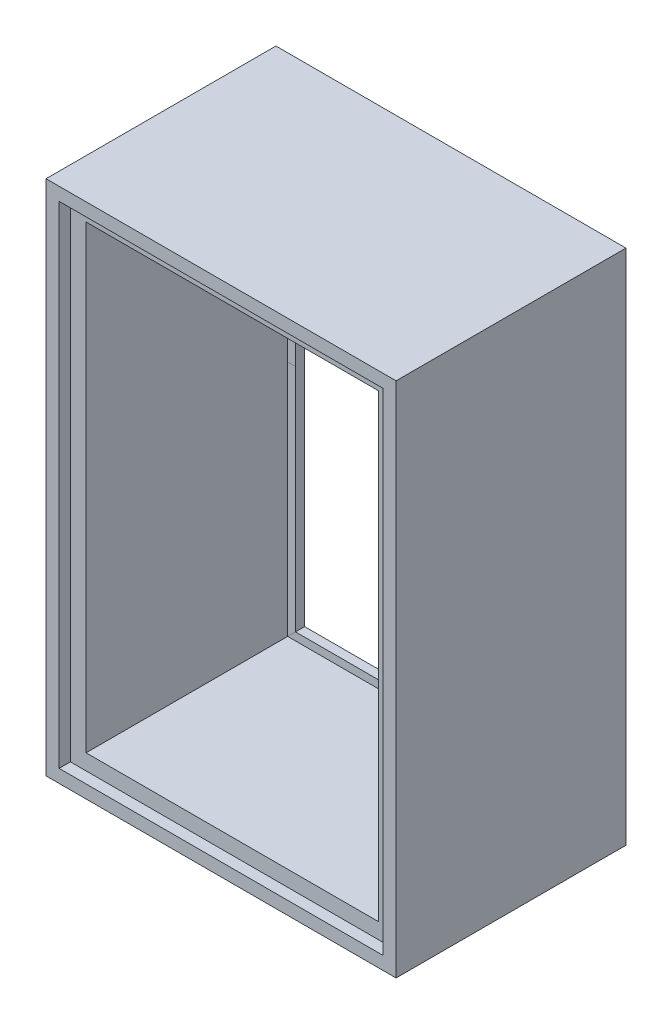
ISO-10303-21;
HEADER;
FILE_DESCRIPTION(('STEP AP214'),'2;1');
FILE_NAME('part.step','',(''),(''),'','','');
FILE_SCHEMA(('AUTOMOTIVE_DESIGN { 1 0 10303 214 1 1 1 1 }'));
ENDSEC;
DATA;
#1=APPLICATION_CONTEXT('core data for automotive mechanical design processes');
#2=APPLICATION_PROTOCOL_DEFINITION('international standard','automotive_design',2000,#1);
#3=PRODUCT_CONTEXT('',#1,'mechanical');
#4=PRODUCT('Part','Part','',(#3));
#5=PRODUCT_RELATED_PRODUCT_CATEGORY('part','',(#4));
#6=PRODUCT_DEFINITION_FORMATION('','',#4);
#7=PRODUCT_DEFINITION_CONTEXT('part definition',#1,'design');
#8=PRODUCT_DEFINITION('design','',#6,#7);
#9=PRODUCT_DEFINITION_SHAPE('','',#8);
#10=(LENGTH_UNIT() NAMED_UNIT(*) SI_UNIT(.MILLI.,.METRE.));
#11=(NAMED_UNIT(*) PLANE_ANGLE_UNIT() SI_UNIT($,.RADIAN.));
#12=(NAMED_UNIT(*) SI_UNIT($,.STERADIAN.) SOLID_ANGLE_UNIT());
#13=UNCERTAINTY_MEASURE_WITH_UNIT(LENGTH_MEASURE(1.E-05),#10,'distance_accuracy_value','');
#14=(GEOMETRIC_REPRESENTATION_CONTEXT(3) GLOBAL_UNCERTAINTY_ASSIGNED_CONTEXT((#13)) GLOBAL_UNIT_ASSIGNED_CONTEXT((#10,
#11,#12)) REPRESENTATION_CONTEXT('',''));
#15=CARTESIAN_POINT('',(0.,0.,0.));
#16=DIRECTION('',(0.,0.,1.));
#17=DIRECTION('',(1.,0.,0.));
#18=AXIS2_PLACEMENT_3D('',#15,#16,#17);
#19=CARTESIAN_POINT('',(88.9,-139.7,-139.7));
#20=DIRECTION('',(1.,0.,0.));
#21=DIRECTION('',(0.,1.,0.));
#22=AXIS2_PLACEMENT_3D('',#19,#20,#21);
#23=PLANE('',#22);
#24=DIRECTION('',(0.,1.,0.));
#25=VECTOR('',#24,1.);
#26=CARTESIAN_POINT('',(88.9,-139.7,-6.858));
#27=LINE('',#26,#25);
#28=CARTESIAN_POINT('',(88.9,-139.7,-6.858));
#29=VERTEX_POINT('',#28);
#30=CARTESIAN_POINT('',(88.9,139.7,-6.858));
#31=VERTEX_POINT('',#30);
#32=EDGE_CURVE('E197',#29,#31,#27,.T.);
#33=ORIENTED_EDGE('',*,*,#32,.T.);
#34=DIRECTION('',(0.,0.,1.));
#35=VECTOR('',#34,1.);
#36=CARTESIAN_POINT('',(88.9,139.7,-139.7));
#37=LINE('',#36,#35);
#38=CARTESIAN_POINT('',(88.9,139.7,-129.38125));
#39=VERTEX_POINT('',#38);
#40=EDGE_CURVE('E239',#39,#31,#37,.T.);
#41=ORIENTED_EDGE('',*,*,#40,.F.);
#42=DIRECTION('',(0.,1.,0.));
#43=VECTOR('',#42,1.);
#44=CARTESIAN_POINT('',(88.8999999999999,-150.2775,-129.38125));
#45=LINE('',#44,#43);
#46=CARTESIAN_POINT('',(88.8999999999999,-139.7,-129.38125));
#47=VERTEX_POINT('',#46);
#48=EDGE_CURVE('E219',#47,#39,#45,.T.);
#49=ORIENTED_EDGE('',*,*,#48,.F.);
#50=DIRECTION('',(0.,0.,1.));
#51=VECTOR('',#50,1.);
#52=CARTESIAN_POINT('',(88.9,-139.7,-139.7));
#53=LINE('',#52,#51);
#54=EDGE_CURVE('E214',#47,#29,#53,.T.);
#55=ORIENTED_EDGE('',*,*,#54,.T.);
#56=EDGE_LOOP('',(#33,#41,#49,#55));
#57=FACE_BOUND('',#56,.T.);
#58=ADVANCED_FACE('F39',(#57),#23,.F.);
#59=CARTESIAN_POINT('',(-88.9,-139.7,-139.7));
#60=DIRECTION('',(0.,-1.,0.));
#61=DIRECTION('',(0.,0.,-1.));
#62=AXIS2_PLACEMENT_3D('',#59,#60,#61);
#63=PLANE('',#62);
#64=DIRECTION('',(1.,0.,0.));
#65=VECTOR('',#64,1.);
#66=CARTESIAN_POINT('',(-88.9,-139.7,-6.858));
#67=LINE('',#66,#65);
#68=CARTESIAN_POINT('',(-88.9,-139.7,-6.858));
#69=VERTEX_POINT('',#68);
#70=EDGE_CURVE('E201',#69,#29,#67,.T.);
#71=ORIENTED_EDGE('',*,*,#70,.T.);
#72=ORIENTED_EDGE('',*,*,#54,.F.);
#73=DIRECTION('',(1.,0.,0.));
#74=VECTOR('',#73,1.);
#75=CARTESIAN_POINT('',(-99.4774999999999,-139.7,-129.38125));
#76=LINE('',#75,#74);
#77=CARTESIAN_POINT('',(-88.8999999999999,-139.7,-129.38125));
#78=VERTEX_POINT('',#77);
#79=EDGE_CURVE('E435',#78,#47,#76,.T.);
#80=ORIENTED_EDGE('',*,*,#79,.F.);
#81=DIRECTION('',(0.,0.,1.));
#82=VECTOR('',#81,1.);
#83=CARTESIAN_POINT('',(-88.9,-139.7,-139.7));
#84=LINE('',#83,#82);
#85=EDGE_CURVE('E216',#78,#69,#84,.T.);
#86=ORIENTED_EDGE('',*,*,#85,.T.);
#87=EDGE_LOOP('',(#71,#72,#80,#86));
#88=FACE_BOUND('',#87,.T.);
#89=ADVANCED_FACE('F212',(#88),#63,.F.);
#90=CARTESIAN_POINT('',(-88.9,139.7,-139.7));
#91=DIRECTION('',(-1.,0.,0.));
#92=DIRECTION('',(0.,-1.,0.));
#93=AXIS2_PLACEMENT_3D('',#90,#91,#92);
#94=PLANE('',#93);
#95=DIRECTION('',(0.,-1.,0.));
#96=VECTOR('',#95,1.);
#97=CARTESIAN_POINT('',(-88.9,139.7,-6.858));
#98=LINE('',#97,#96);
#99=CARTESIAN_POINT('',(-88.9,139.7,-6.858));
#100=VERTEX_POINT('',#99);
#101=EDGE_CURVE('E56',#100,#69,#98,.T.);
#102=ORIENTED_EDGE('',*,*,#101,.T.);
#103=ORIENTED_EDGE('',*,*,#85,.F.);
#104=DIRECTION('',(0.,-1.,0.));
#105=VECTOR('',#104,1.);
#106=CARTESIAN_POINT('',(-88.9,0.,-129.38125));
#107=LINE('',#106,#105);
#108=CARTESIAN_POINT('',(-88.9,0.,-129.38125));
#109=VERTEX_POINT('',#108);
#110=EDGE_CURVE('E374',#109,#78,#107,.T.);
#111=ORIENTED_EDGE('',*,*,#110,.F.);
#112=DIRECTION('',(0.,-1.,0.));
#113=VECTOR('',#112,1.);
#114=CARTESIAN_POINT('',(-88.9,150.2775,-129.38125));
#115=LINE('',#114,#113);
#116=CARTESIAN_POINT('',(-88.9,139.7,-129.38125));
#117=VERTEX_POINT('',#116);
#118=EDGE_CURVE('E408',#117,#109,#115,.T.);
#119=ORIENTED_EDGE('',*,*,#118,.F.);
#120=DIRECTION('',(0.,0.,1.));
#121=VECTOR('',#120,1.);
#122=CARTESIAN_POINT('',(-88.9,139.7,-139.7));
#123=LINE('',#122,#121);
#124=EDGE_CURVE('E235',#117,#100,#123,.T.);
#125=ORIENTED_EDGE('',*,*,#124,.T.);
#126=EDGE_LOOP('',(#102,#103,#111,#119,#125));
#127=FACE_BOUND('',#126,.T.);
#128=ADVANCED_FACE('F301',(#127),#94,.F.);
#129=CARTESIAN_POINT('',(88.9,139.7,-139.7));
#130=DIRECTION('',(0.,1.,0.));
#131=DIRECTION('',(0.,0.,1.));
#132=AXIS2_PLACEMENT_3D('',#129,#130,#131);
#133=PLANE('',#132);
#134=DIRECTION('',(-1.,0.,0.));
#135=VECTOR('',#134,1.);
#136=CARTESIAN_POINT('',(88.9,139.7,-6.858));
#137=LINE('',#136,#135);
#138=EDGE_CURVE('E202',#31,#100,#137,.T.);
#139=ORIENTED_EDGE('',*,*,#138,.T.);
#140=ORIENTED_EDGE('',*,*,#124,.F.);
#141=DIRECTION('',(-1.,0.,0.));
#142=VECTOR('',#141,1.);
#143=CARTESIAN_POINT('',(99.4775,139.7,-129.38125));
#144=LINE('',#143,#142);
#145=EDGE_CURVE('E355',#39,#117,#144,.T.);
#146=ORIENTED_EDGE('',*,*,#145,.F.);
#147=ORIENTED_EDGE('',*,*,#40,.T.);
#148=EDGE_LOOP('',(#139,#140,#146,#147));
#149=FACE_BOUND('',#148,.T.);
#150=ADVANCED_FACE('F307',(#149),#133,.F.);
#151=DIRECTION('',(0.,1.,0.));
#152=VECTOR('',#151,1.);
#153=CARTESIAN_POINT('',(88.8999999999999,-150.2775,-134.14375));
#154=LINE('',#153,#152);
#155=CARTESIAN_POINT('',(88.8999999999999,-139.7,-134.14375));
#156=VERTEX_POINT('',#155);
#157=CARTESIAN_POINT('',(88.9,139.7,-134.14375));
#158=VERTEX_POINT('',#157);
#159=EDGE_CURVE('E318',#156,#158,#154,.T.);
#160=ORIENTED_EDGE('',*,*,#159,.T.);
#161=CARTESIAN_POINT('',(88.9,139.7,-139.7));
#162=VERTEX_POINT('',#161);
#163=EDGE_CURVE('E236',#162,#158,#37,.T.);
#164=ORIENTED_EDGE('',*,*,#163,.F.);
#165=DIRECTION('',(0.,1.,0.));
#166=VECTOR('',#165,1.);
#167=CARTESIAN_POINT('',(88.9,-139.7,-139.7));
#168=LINE('',#167,#166);
#169=CARTESIAN_POINT('',(88.9,-139.7,-139.7));
#170=VERTEX_POINT('',#169);
#171=EDGE_CURVE('E337',#170,#162,#168,.T.);
#172=ORIENTED_EDGE('',*,*,#171,.F.);
#173=EDGE_CURVE('E220',#170,#156,#53,.T.);
#174=ORIENTED_EDGE('',*,*,#173,.T.);
#175=EDGE_LOOP('',(#160,#164,#172,#174));
#176=FACE_BOUND('',#175,.T.);
#177=ADVANCED_FACE('F297',(#176),#23,.F.);
#178=DIRECTION('',(1.,0.,0.));
#179=VECTOR('',#178,1.);
#180=CARTESIAN_POINT('',(-99.4774999999999,-139.7,-134.14375));
#181=LINE('',#180,#179);
#182=CARTESIAN_POINT('',(-88.8999999999999,-139.7,-134.14375));
#183=VERTEX_POINT('',#182);
#184=EDGE_CURVE('E438',#183,#156,#181,.T.);
#185=ORIENTED_EDGE('',*,*,#184,.T.);
#186=ORIENTED_EDGE('',*,*,#173,.F.);
#187=DIRECTION('',(1.,0.,0.));
#188=VECTOR('',#187,1.);
#189=CARTESIAN_POINT('',(-88.9,-139.7,-139.7));
#190=LINE('',#189,#188);
#191=CARTESIAN_POINT('',(-88.9,-139.7,-139.7));
#192=VERTEX_POINT('',#191);
#193=EDGE_CURVE('E228',#192,#170,#190,.T.);
#194=ORIENTED_EDGE('',*,*,#193,.F.);
#195=EDGE_CURVE('E221',#192,#183,#84,.T.);
#196=ORIENTED_EDGE('',*,*,#195,.T.);
#197=EDGE_LOOP('',(#185,#186,#194,#196));
#198=FACE_BOUND('',#197,.T.);
#199=ADVANCED_FACE('F303',(#198),#63,.F.);
#200=DIRECTION('',(0.,-1.,0.));
#201=VECTOR('',#200,1.);
#202=CARTESIAN_POINT('',(-88.9,150.2775,-134.14375));
#203=LINE('',#202,#201);
#204=CARTESIAN_POINT('',(-88.9,139.7,-134.14375));
#205=VERTEX_POINT('',#204);
#206=CARTESIAN_POINT('',(-88.9,0.,-134.14375));
#207=VERTEX_POINT('',#206);
#208=EDGE_CURVE('E397',#205,#207,#203,.T.);
#209=ORIENTED_EDGE('',*,*,#208,.T.);
#210=DIRECTION('',(0.,-1.,0.));
#211=VECTOR('',#210,1.);
#212=CARTESIAN_POINT('',(-88.9,0.,-134.14375));
#213=LINE('',#212,#211);
#214=EDGE_CURVE('E369',#207,#183,#213,.T.);
#215=ORIENTED_EDGE('',*,*,#214,.T.);
#216=ORIENTED_EDGE('',*,*,#195,.F.);
#217=DIRECTION('',(0.,-1.,0.));
#218=VECTOR('',#217,1.);
#219=CARTESIAN_POINT('',(-88.9,139.7,-139.7));
#220=LINE('',#219,#218);
#221=CARTESIAN_POINT('',(-88.9,139.7,-139.7));
#222=VERTEX_POINT('',#221);
#223=EDGE_CURVE('E336',#222,#192,#220,.T.);
#224=ORIENTED_EDGE('',*,*,#223,.F.);
#225=EDGE_CURVE('E231',#222,#205,#123,.T.);
#226=ORIENTED_EDGE('',*,*,#225,.T.);
#227=EDGE_LOOP('',(#209,#215,#216,#224,#226));
#228=FACE_BOUND('',#227,.T.);
#229=ADVANCED_FACE('F313',(#228),#94,.F.);
#230=DIRECTION('',(-1.,0.,0.));
#231=VECTOR('',#230,1.);
#232=CARTESIAN_POINT('',(99.4775,139.7,-134.14375));
#233=LINE('',#232,#231);
#234=EDGE_CURVE('E329',#158,#205,#233,.T.);
#235=ORIENTED_EDGE('',*,*,#234,.T.);
#236=ORIENTED_EDGE('',*,*,#225,.F.);
#237=DIRECTION('',(-1.,0.,0.));
#238=VECTOR('',#237,1.);
#239=CARTESIAN_POINT('',(88.9,139.7,-139.7));
#240=LINE('',#239,#238);
#241=EDGE_CURVE('E331',#162,#222,#240,.T.);
#242=ORIENTED_EDGE('',*,*,#241,.F.);
#243=ORIENTED_EDGE('',*,*,#163,.T.);
#244=EDGE_LOOP('',(#235,#236,#242,#243));
#245=FACE_BOUND('',#244,.T.);
#246=ADVANCED_FACE('F316',(#245),#133,.F.);
#247=CARTESIAN_POINT('',(106.3625,-157.1625,-139.7));
#248=DIRECTION('',(1.,0.,0.));
#249=DIRECTION('',(0.,1.,0.));
#250=AXIS2_PLACEMENT_3D('',#247,#248,#249);
#251=PLANE('',#250);
#252=DIRECTION('',(0.,1.,0.));
#253=VECTOR('',#252,1.);
#254=CARTESIAN_POINT('',(106.3625,-157.1625,0.));
#255=LINE('',#254,#253);
#256=CARTESIAN_POINT('',(106.3625,-157.1625,0.));
#257=VERTEX_POINT('',#256);
#258=CARTESIAN_POINT('',(106.3625,157.1625,0.));
#259=VERTEX_POINT('',#258);
#260=EDGE_CURVE('E224',#257,#259,#255,.T.);
#261=ORIENTED_EDGE('',*,*,#260,.F.);
#262=DIRECTION('',(0.,0.,1.));
#263=VECTOR('',#262,1.);
#264=CARTESIAN_POINT('',(106.3625,-157.1625,-139.7));
#265=LINE('',#264,#263);
#266=CARTESIAN_POINT('',(106.3625,-157.1625,-139.7));
#267=VERTEX_POINT('',#266);
#268=EDGE_CURVE('E11',#267,#257,#265,.T.);
#269=ORIENTED_EDGE('',*,*,#268,.F.);
#270=DIRECTION('',(0.,1.,0.));
#271=VECTOR('',#270,1.);
#272=CARTESIAN_POINT('',(106.3625,-157.1625,-139.7));
#273=LINE('',#272,#271);
#274=CARTESIAN_POINT('',(106.3625,157.1625,-139.7));
#275=VERTEX_POINT('',#274);
#276=EDGE_CURVE('E240',#267,#275,#273,.T.);
#277=ORIENTED_EDGE('',*,*,#276,.T.);
#278=DIRECTION('',(0.,0.,1.));
#279=VECTOR('',#278,1.);
#280=CARTESIAN_POINT('',(106.3625,157.1625,-139.7));
#281=LINE('',#280,#279);
#282=EDGE_CURVE('E43',#275,#259,#281,.T.);
#283=ORIENTED_EDGE('',*,*,#282,.T.);
#284=EDGE_LOOP('',(#261,#269,#277,#283));
#285=FACE_BOUND('',#284,.T.);
#286=ADVANCED_FACE('F41',(#285),#251,.T.);
#287=CARTESIAN_POINT('',(-106.3625,-157.1625,-139.7));
#288=DIRECTION('',(0.,-1.,0.));
#289=DIRECTION('',(1.,0.,0.));
#290=AXIS2_PLACEMENT_3D('',#287,#288,#289);
#291=PLANE('',#290);
#292=DIRECTION('',(1.,0.,0.));
#293=VECTOR('',#292,1.);
#294=CARTESIAN_POINT('',(-106.3625,-157.1625,0.));
#295=LINE('',#294,#293);
#296=CARTESIAN_POINT('',(-106.3625,-157.1625,0.));
#297=VERTEX_POINT('',#296);
#298=EDGE_CURVE('E244',#297,#257,#295,.T.);
#299=ORIENTED_EDGE('',*,*,#298,.F.);
#300=DIRECTION('',(0.,0.,1.));
#301=VECTOR('',#300,1.);
#302=CARTESIAN_POINT('',(-106.3625,-157.1625,-139.7));
#303=LINE('',#302,#301);
#304=CARTESIAN_POINT('',(-106.3625,-157.1625,-139.7));
#305=VERTEX_POINT('',#304);
#306=EDGE_CURVE('E48',#305,#297,#303,.T.);
#307=ORIENTED_EDGE('',*,*,#306,.F.);
#308=DIRECTION('',(1.,0.,0.));
#309=VECTOR('',#308,1.);
#310=CARTESIAN_POINT('',(-106.3625,-157.1625,-139.7));
#311=LINE('',#310,#309);
#312=EDGE_CURVE('E252',#305,#267,#311,.T.);
#313=ORIENTED_EDGE('',*,*,#312,.T.);
#314=ORIENTED_EDGE('',*,*,#268,.T.);
#315=EDGE_LOOP('',(#299,#307,#313,#314));
#316=FACE_BOUND('',#315,.T.);
#317=ADVANCED_FACE('F281',(#316),#291,.T.);
#318=CARTESIAN_POINT('',(-106.3625,157.1625,-139.7));
#319=DIRECTION('',(-1.,0.,0.));
#320=DIRECTION('',(0.,-1.,0.));
#321=AXIS2_PLACEMENT_3D('',#318,#319,#320);
#322=PLANE('',#321);
#323=DIRECTION('',(0.,-1.,0.));
#324=VECTOR('',#323,1.);
#325=CARTESIAN_POINT('',(-106.3625,157.1625,0.));
#326=LINE('',#325,#324);
#327=CARTESIAN_POINT('',(-106.3625,157.1625,0.));
#328=VERTEX_POINT('',#327);
#329=EDGE_CURVE('E261',#328,#297,#326,.T.);
#330=ORIENTED_EDGE('',*,*,#329,.F.);
#331=DIRECTION('',(0.,0.,1.));
#332=VECTOR('',#331,1.);
#333=CARTESIAN_POINT('',(-106.3625,157.1625,-139.7));
#334=LINE('',#333,#332);
#335=CARTESIAN_POINT('',(-106.3625,157.1625,-139.7));
#336=VERTEX_POINT('',#335);
#337=EDGE_CURVE('E267',#336,#328,#334,.T.);
#338=ORIENTED_EDGE('',*,*,#337,.F.);
#339=DIRECTION('',(0.,-1.,0.));
#340=VECTOR('',#339,1.);
#341=CARTESIAN_POINT('',(-106.3625,157.1625,-139.7));
#342=LINE('',#341,#340);
#343=EDGE_CURVE('E248',#336,#305,#342,.T.);
#344=ORIENTED_EDGE('',*,*,#343,.T.);
#345=ORIENTED_EDGE('',*,*,#306,.T.);
#346=EDGE_LOOP('',(#330,#338,#344,#345));
#347=FACE_BOUND('',#346,.T.);
#348=ADVANCED_FACE('F287',(#347),#322,.T.);
#349=CARTESIAN_POINT('',(106.3625,157.1625,-139.7));
#350=DIRECTION('',(0.,1.,0.));
#351=DIRECTION('',(-1.,0.,0.));
#352=AXIS2_PLACEMENT_3D('',#349,#350,#351);
#353=PLANE('',#352);
#354=DIRECTION('',(-1.,0.,0.));
#355=VECTOR('',#354,1.);
#356=CARTESIAN_POINT('',(106.3625,157.1625,0.));
#357=LINE('',#356,#355);
#358=EDGE_CURVE('E257',#259,#328,#357,.T.);
#359=ORIENTED_EDGE('',*,*,#358,.F.);
#360=ORIENTED_EDGE('',*,*,#282,.F.);
#361=DIRECTION('',(-1.,0.,0.));
#362=VECTOR('',#361,1.);
#363=CARTESIAN_POINT('',(106.3625,157.1625,-139.7));
#364=LINE('',#363,#362);
#365=EDGE_CURVE('E243',#275,#336,#364,.T.);
#366=ORIENTED_EDGE('',*,*,#365,.T.);
#367=ORIENTED_EDGE('',*,*,#337,.T.);
#368=EDGE_LOOP('',(#359,#360,#366,#367));
#369=FACE_BOUND('',#368,.T.);
#370=ADVANCED_FACE('F276',(#369),#353,.T.);
#371=CARTESIAN_POINT('',(0.,0.,-139.7));
#372=DIRECTION('',(0.,0.,1.));
#373=DIRECTION('',(1.,0.,0.));
#374=AXIS2_PLACEMENT_3D('',#371,#372,#373);
#375=PLANE('',#374);
#376=ORIENTED_EDGE('',*,*,#193,.T.);
#377=ORIENTED_EDGE('',*,*,#171,.T.);
#378=ORIENTED_EDGE('',*,*,#241,.T.);
#379=ORIENTED_EDGE('',*,*,#223,.T.);
#380=EDGE_LOOP('',(#376,#377,#378,#379));
#381=FACE_BOUND('',#380,.T.);
#382=ORIENTED_EDGE('',*,*,#276,.F.);
#383=ORIENTED_EDGE('',*,*,#312,.F.);
#384=ORIENTED_EDGE('',*,*,#343,.F.);
#385=ORIENTED_EDGE('',*,*,#365,.F.);
#386=EDGE_LOOP('',(#382,#383,#384,#385));
#387=FACE_BOUND('',#386,.T.);
#388=ADVANCED_FACE('F284',(#381,#387),#375,.F.);
#389=CARTESIAN_POINT('',(0.,0.,0.));
#390=DIRECTION('',(0.,0.,1.));
#391=DIRECTION('',(1.,0.,0.));
#392=AXIS2_PLACEMENT_3D('',#389,#390,#391);
#393=PLANE('',#392);
#394=DIRECTION('',(1.,0.,0.));
#395=VECTOR('',#394,1.);
#396=CARTESIAN_POINT('',(-98.425,-149.225,0.));
#397=LINE('',#396,#395);
#398=CARTESIAN_POINT('',(-98.425,-149.225,0.));
#399=VERTEX_POINT('',#398);
#400=CARTESIAN_POINT('',(98.425,-149.225,0.));
#401=VERTEX_POINT('',#400);
#402=EDGE_CURVE('E64',#399,#401,#397,.T.);
#403=ORIENTED_EDGE('',*,*,#402,.F.);
#404=DIRECTION('',(0.,-1.,0.));
#405=VECTOR('',#404,1.);
#406=CARTESIAN_POINT('',(-98.425,149.225,0.));
#407=LINE('',#406,#405);
#408=CARTESIAN_POINT('',(-98.425,149.225,0.));
#409=VERTEX_POINT('',#408);
#410=EDGE_CURVE('E462',#409,#399,#407,.T.);
#411=ORIENTED_EDGE('',*,*,#410,.F.);
#412=DIRECTION('',(-1.,0.,0.));
#413=VECTOR('',#412,1.);
#414=CARTESIAN_POINT('',(98.425,149.225,0.));
#415=LINE('',#414,#413);
#416=CARTESIAN_POINT('',(98.425,149.225,0.));
#417=VERTEX_POINT('',#416);
#418=EDGE_CURVE('E466',#417,#409,#415,.T.);
#419=ORIENTED_EDGE('',*,*,#418,.F.);
#420=DIRECTION('',(0.,1.,0.));
#421=VECTOR('',#420,1.);
#422=CARTESIAN_POINT('',(98.425,-149.225,0.));
#423=LINE('',#422,#421);
#424=EDGE_CURVE('E470',#401,#417,#423,.T.);
#425=ORIENTED_EDGE('',*,*,#424,.F.);
#426=EDGE_LOOP('',(#403,#411,#419,#425));
#427=FACE_BOUND('',#426,.T.);
#428=ORIENTED_EDGE('',*,*,#260,.T.);
#429=ORIENTED_EDGE('',*,*,#358,.T.);
#430=ORIENTED_EDGE('',*,*,#329,.T.);
#431=ORIENTED_EDGE('',*,*,#298,.T.);
#432=EDGE_LOOP('',(#428,#429,#430,#431));
#433=FACE_BOUND('',#432,.T.);
#434=ADVANCED_FACE('F278',(#427,#433),#393,.T.);
#435=CARTESIAN_POINT('',(99.4775,149.225,-134.14375));
#436=DIRECTION('',(0.,0.,1.));
#437=DIRECTION('',(1.,0.,0.));
#438=AXIS2_PLACEMENT_3D('',#435,#436,#437);
#439=PLANE('',#438);
#440=DIRECTION('',(-1.,0.,0.));
#441=VECTOR('',#440,1.);
#442=CARTESIAN_POINT('',(99.4775,149.225,-134.14375));
#443=LINE('',#442,#441);
#444=CARTESIAN_POINT('',(98.425,149.225,-134.14375));
#445=VERTEX_POINT('',#444);
#446=CARTESIAN_POINT('',(-98.425,149.225,-134.14375));
#447=VERTEX_POINT('',#446);
#448=EDGE_CURVE('E347',#445,#447,#443,.T.);
#449=ORIENTED_EDGE('',*,*,#448,.T.);
#450=DIRECTION('',(0.707106781186548,-0.707106781186547,0.));
#451=VECTOR('',#450,1.);
#452=CARTESIAN_POINT('',(-98.95125,149.75125,-134.14375));
#453=LINE('',#452,#451);
#454=EDGE_CURVE('E399',#447,#205,#453,.T.);
#455=ORIENTED_EDGE('',*,*,#454,.T.);
#456=ORIENTED_EDGE('',*,*,#234,.F.);
#457=DIRECTION('',(-0.707106781186548,-0.707106781186548,0.));
#458=VECTOR('',#457,1.);
#459=CARTESIAN_POINT('',(-51.32625,-0.526250000000006,-134.14375));
#460=LINE('',#459,#458);
#461=EDGE_CURVE('E420',#445,#158,#460,.T.);
#462=ORIENTED_EDGE('',*,*,#461,.F.);
#463=EDGE_LOOP('',(#449,#455,#456,#462));
#464=FACE_BOUND('',#463,.T.);
#465=ADVANCED_FACE('F539',(#464),#439,.T.);
#466=CARTESIAN_POINT('',(99.4775,149.225,-129.38125));
#467=DIRECTION('',(0.,0.,-1.));
#468=DIRECTION('',(-1.,0.,0.));
#469=AXIS2_PLACEMENT_3D('',#466,#467,#468);
#470=PLANE('',#469);
#471=ORIENTED_EDGE('',*,*,#145,.T.);
#472=DIRECTION('',(-0.707106781186548,0.707106781186547,0.));
#473=VECTOR('',#472,1.);
#474=CARTESIAN_POINT('',(-98.95125,149.75125,-129.38125));
#475=LINE('',#474,#473);
#476=CARTESIAN_POINT('',(-98.425,149.225,-129.38125));
#477=VERTEX_POINT('',#476);
#478=EDGE_CURVE('E373',#117,#477,#475,.T.);
#479=ORIENTED_EDGE('',*,*,#478,.T.);
#480=DIRECTION('',(-1.,0.,0.));
#481=VECTOR('',#480,1.);
#482=CARTESIAN_POINT('',(99.4775,149.225,-129.38125));
#483=LINE('',#482,#481);
#484=CARTESIAN_POINT('',(98.425,149.225,-129.38125));
#485=VERTEX_POINT('',#484);
#486=EDGE_CURVE('E360',#485,#477,#483,.T.);
#487=ORIENTED_EDGE('',*,*,#486,.F.);
#488=DIRECTION('',(0.707106781186548,0.707106781186548,0.));
#489=VECTOR('',#488,1.);
#490=CARTESIAN_POINT('',(-51.32625,-0.526250000000006,-129.38125));
#491=LINE('',#490,#489);
#492=EDGE_CURVE('E429',#39,#485,#491,.T.);
#493=ORIENTED_EDGE('',*,*,#492,.F.);
#494=EDGE_LOOP('',(#471,#479,#487,#493));
#495=FACE_BOUND('',#494,.T.);
#496=ADVANCED_FACE('F584',(#495),#470,.T.);
#497=CARTESIAN_POINT('',(99.4775,149.225,-134.14375));
#498=DIRECTION('',(0.,-1.,0.));
#499=DIRECTION('',(0.,0.,-1.));
#500=AXIS2_PLACEMENT_3D('',#497,#498,#499);
#501=PLANE('',#500);
#502=ORIENTED_EDGE('',*,*,#486,.T.);
#503=DIRECTION('',(0.,0.,-1.));
#504=VECTOR('',#503,1.);
#505=CARTESIAN_POINT('',(-98.425,149.225,-134.14375));
#506=LINE('',#505,#504);
#507=EDGE_CURVE('E324',#477,#447,#506,.T.);
#508=ORIENTED_EDGE('',*,*,#507,.T.);
#509=ORIENTED_EDGE('',*,*,#448,.F.);
#510=DIRECTION('',(0.,0.,-1.));
#511=VECTOR('',#510,1.);
#512=CARTESIAN_POINT('',(98.425,149.225,-134.14375));
#513=LINE('',#512,#511);
#514=EDGE_CURVE('E417',#485,#445,#513,.T.);
#515=ORIENTED_EDGE('',*,*,#514,.F.);
#516=EDGE_LOOP('',(#502,#508,#509,#515));
#517=FACE_BOUND('',#516,.T.);
#518=ADVANCED_FACE('F535',(#517),#501,.T.);
#519=CARTESIAN_POINT('',(-98.425,150.2775,-134.14375));
#520=DIRECTION('',(1.,0.,0.));
#521=DIRECTION('',(0.,1.,0.));
#522=AXIS2_PLACEMENT_3D('',#519,#520,#521);
#523=PLANE('',#522);
#524=ORIENTED_EDGE('',*,*,#507,.F.);
#525=DIRECTION('',(0.,-1.,0.));
#526=VECTOR('',#525,1.);
#527=CARTESIAN_POINT('',(-98.425,150.2775,-129.38125));
#528=LINE('',#527,#526);
#529=CARTESIAN_POINT('',(-98.425,0.,-129.38125));
#530=VERTEX_POINT('',#529);
#531=EDGE_CURVE('E411',#477,#530,#528,.T.);
#532=ORIENTED_EDGE('',*,*,#531,.T.);
#533=DIRECTION('',(0.,0.,1.));
#534=VECTOR('',#533,1.);
#535=CARTESIAN_POINT('',(-98.425,0.,-134.14375));
#536=LINE('',#535,#534);
#537=CARTESIAN_POINT('',(-98.425,0.,-134.14375));
#538=VERTEX_POINT('',#537);
#539=EDGE_CURVE('E393',#538,#530,#536,.T.);
#540=ORIENTED_EDGE('',*,*,#539,.F.);
#541=DIRECTION('',(0.,-1.,0.));
#542=VECTOR('',#541,1.);
#543=CARTESIAN_POINT('',(-98.425,150.2775,-134.14375));
#544=LINE('',#543,#542);
#545=EDGE_CURVE('E414',#447,#538,#544,.T.);
#546=ORIENTED_EDGE('',*,*,#545,.F.);
#547=EDGE_LOOP('',(#524,#532,#540,#546));
#548=FACE_BOUND('',#547,.T.);
#549=ADVANCED_FACE('F531',(#548),#523,.T.);
#550=CARTESIAN_POINT('',(-98.425,150.2775,-129.38125));
#551=DIRECTION('',(0.,0.,-1.));
#552=DIRECTION('',(-1.,0.,0.));
#553=AXIS2_PLACEMENT_3D('',#550,#551,#552);
#554=PLANE('',#553);
#555=ORIENTED_EDGE('',*,*,#478,.F.);
#556=ORIENTED_EDGE('',*,*,#118,.T.);
#557=DIRECTION('',(1.,0.,0.));
#558=VECTOR('',#557,1.);
#559=CARTESIAN_POINT('',(-98.425,0.,-129.38125));
#560=LINE('',#559,#558);
#561=EDGE_CURVE('E389',#530,#109,#560,.T.);
#562=ORIENTED_EDGE('',*,*,#561,.F.);
#563=ORIENTED_EDGE('',*,*,#531,.F.);
#564=EDGE_LOOP('',(#555,#556,#562,#563));
#565=FACE_BOUND('',#564,.T.);
#566=ADVANCED_FACE('F497',(#565),#554,.T.);
#567=CARTESIAN_POINT('',(-98.425,150.2775,-134.14375));
#568=DIRECTION('',(0.,0.,1.));
#569=DIRECTION('',(1.,0.,0.));
#570=AXIS2_PLACEMENT_3D('',#567,#568,#569);
#571=PLANE('',#570);
#572=ORIENTED_EDGE('',*,*,#454,.F.);
#573=ORIENTED_EDGE('',*,*,#545,.T.);
#574=DIRECTION('',(-1.,0.,0.));
#575=VECTOR('',#574,1.);
#576=CARTESIAN_POINT('',(-98.425,0.,-134.14375));
#577=LINE('',#576,#575);
#578=EDGE_CURVE('E385',#207,#538,#577,.T.);
#579=ORIENTED_EDGE('',*,*,#578,.F.);
#580=ORIENTED_EDGE('',*,*,#208,.F.);
#581=EDGE_LOOP('',(#572,#573,#579,#580));
#582=FACE_BOUND('',#581,.T.);
#583=ADVANCED_FACE('F541',(#582),#571,.T.);
#584=CARTESIAN_POINT('',(-98.425,0.,-134.14375));
#585=DIRECTION('',(1.,0.,0.));
#586=DIRECTION('',(0.,1.,0.));
#587=AXIS2_PLACEMENT_3D('',#584,#585,#586);
#588=PLANE('',#587);
#589=DIRECTION('',(0.,-1.,0.));
#590=VECTOR('',#589,1.);
#591=CARTESIAN_POINT('',(-98.425,0.,-129.38125));
#592=LINE('',#591,#590);
#593=CARTESIAN_POINT('',(-98.425,-149.225,-129.38125));
#594=VERTEX_POINT('',#593);
#595=EDGE_CURVE('E377',#530,#594,#592,.T.);
#596=ORIENTED_EDGE('',*,*,#595,.T.);
#597=DIRECTION('',(0.,0.,-1.));
#598=VECTOR('',#597,1.);
#599=CARTESIAN_POINT('',(-98.4249999999999,-149.225,-134.14375));
#600=LINE('',#599,#598);
#601=CARTESIAN_POINT('',(-98.425,-149.225,-134.14375));
#602=VERTEX_POINT('',#601);
#603=EDGE_CURVE('E443',#594,#602,#600,.T.);
#604=ORIENTED_EDGE('',*,*,#603,.T.);
#605=DIRECTION('',(0.,-1.,0.));
#606=VECTOR('',#605,1.);
#607=CARTESIAN_POINT('',(-98.425,0.,-134.14375));
#608=LINE('',#607,#606);
#609=EDGE_CURVE('E381',#538,#602,#608,.T.);
#610=ORIENTED_EDGE('',*,*,#609,.F.);
#611=ORIENTED_EDGE('',*,*,#539,.T.);
#612=EDGE_LOOP('',(#596,#604,#610,#611));
#613=FACE_BOUND('',#612,.T.);
#614=ADVANCED_FACE('F505',(#613),#588,.T.);
#615=CARTESIAN_POINT('',(-98.425,0.,-129.38125));
#616=DIRECTION('',(0.,0.,-1.));
#617=DIRECTION('',(-1.,0.,0.));
#618=AXIS2_PLACEMENT_3D('',#615,#616,#617);
#619=PLANE('',#618);
#620=ORIENTED_EDGE('',*,*,#110,.T.);
#621=DIRECTION('',(-0.707106781186548,-0.707106781186548,0.));
#622=VECTOR('',#621,1.);
#623=CARTESIAN_POINT('',(-98.9512499999999,-149.75125,-129.38125));
#624=LINE('',#623,#622);
#625=EDGE_CURVE('E444',#78,#594,#624,.T.);
#626=ORIENTED_EDGE('',*,*,#625,.T.);
#627=ORIENTED_EDGE('',*,*,#595,.F.);
#628=ORIENTED_EDGE('',*,*,#561,.T.);
#629=EDGE_LOOP('',(#620,#626,#627,#628));
#630=FACE_BOUND('',#629,.T.);
#631=ADVANCED_FACE('F501',(#630),#619,.T.);
#632=CARTESIAN_POINT('',(-98.425,0.,-134.14375));
#633=DIRECTION('',(0.,0.,1.));
#634=DIRECTION('',(1.,0.,0.));
#635=AXIS2_PLACEMENT_3D('',#632,#633,#634);
#636=PLANE('',#635);
#637=ORIENTED_EDGE('',*,*,#609,.T.);
#638=DIRECTION('',(0.707106781186548,0.707106781186548,0.));
#639=VECTOR('',#638,1.);
#640=CARTESIAN_POINT('',(-98.9512499999999,-149.75125,-134.14375));
#641=LINE('',#640,#639);
#642=EDGE_CURVE('E431',#602,#183,#641,.T.);
#643=ORIENTED_EDGE('',*,*,#642,.T.);
#644=ORIENTED_EDGE('',*,*,#214,.F.);
#645=ORIENTED_EDGE('',*,*,#578,.T.);
#646=EDGE_LOOP('',(#637,#643,#644,#645));
#647=FACE_BOUND('',#646,.T.);
#648=ADVANCED_FACE('F525',(#647),#636,.T.);
#649=CARTESIAN_POINT('',(98.425,-150.2775,-134.14375));
#650=DIRECTION('',(0.,0.,1.));
#651=DIRECTION('',(1.,0.,0.));
#652=AXIS2_PLACEMENT_3D('',#649,#650,#651);
#653=PLANE('',#652);
#654=DIRECTION('',(0.,1.,0.));
#655=VECTOR('',#654,1.);
#656=CARTESIAN_POINT('',(98.425,-150.2775,-134.14375));
#657=LINE('',#656,#655);
#658=CARTESIAN_POINT('',(98.425,-149.225,-134.14375));
#659=VERTEX_POINT('',#658);
#660=EDGE_CURVE('E421',#659,#445,#657,.T.);
#661=ORIENTED_EDGE('',*,*,#660,.T.);
#662=ORIENTED_EDGE('',*,*,#461,.T.);
#663=ORIENTED_EDGE('',*,*,#159,.F.);
#664=DIRECTION('',(-0.707106781186548,0.707106781186548,0.));
#665=VECTOR('',#664,1.);
#666=CARTESIAN_POINT('',(-0.526249999999992,-50.27375,-134.14375));
#667=LINE('',#666,#665);
#668=EDGE_CURVE('E450',#659,#156,#667,.T.);
#669=ORIENTED_EDGE('',*,*,#668,.F.);
#670=EDGE_LOOP('',(#661,#662,#663,#669));
#671=FACE_BOUND('',#670,.T.);
#672=ADVANCED_FACE('F630',(#671),#653,.T.);
#673=CARTESIAN_POINT('',(98.425,-150.2775,-129.38125));
#674=DIRECTION('',(0.,0.,-1.));
#675=DIRECTION('',(-1.,0.,0.));
#676=AXIS2_PLACEMENT_3D('',#673,#674,#675);
#677=PLANE('',#676);
#678=ORIENTED_EDGE('',*,*,#48,.T.);
#679=ORIENTED_EDGE('',*,*,#492,.T.);
#680=DIRECTION('',(0.,1.,0.));
#681=VECTOR('',#680,1.);
#682=CARTESIAN_POINT('',(98.425,-150.2775,-129.38125));
#683=LINE('',#682,#681);
#684=CARTESIAN_POINT('',(98.425,-149.225,-129.38125));
#685=VERTEX_POINT('',#684);
#686=EDGE_CURVE('E424',#685,#485,#683,.T.);
#687=ORIENTED_EDGE('',*,*,#686,.F.);
#688=DIRECTION('',(0.707106781186548,-0.707106781186548,0.));
#689=VECTOR('',#688,1.);
#690=CARTESIAN_POINT('',(-0.526249999999992,-50.27375,-129.38125));
#691=LINE('',#690,#689);
#692=EDGE_CURVE('E446',#47,#685,#691,.T.);
#693=ORIENTED_EDGE('',*,*,#692,.F.);
#694=EDGE_LOOP('',(#678,#679,#687,#693));
#695=FACE_BOUND('',#694,.T.);
#696=ADVANCED_FACE('F516',(#695),#677,.T.);
#697=CARTESIAN_POINT('',(98.425,-150.2775,-134.14375));
#698=DIRECTION('',(-1.,0.,0.));
#699=DIRECTION('',(0.,-1.,0.));
#700=AXIS2_PLACEMENT_3D('',#697,#698,#699);
#701=PLANE('',#700);
#702=ORIENTED_EDGE('',*,*,#686,.T.);
#703=ORIENTED_EDGE('',*,*,#514,.T.);
#704=ORIENTED_EDGE('',*,*,#660,.F.);
#705=DIRECTION('',(0.,0.,-1.));
#706=VECTOR('',#705,1.);
#707=CARTESIAN_POINT('',(98.4249999999999,-149.225,-134.14375));
#708=LINE('',#707,#706);
#709=EDGE_CURVE('E441',#685,#659,#708,.T.);
#710=ORIENTED_EDGE('',*,*,#709,.F.);
#711=EDGE_LOOP('',(#702,#703,#704,#710));
#712=FACE_BOUND('',#711,.T.);
#713=ADVANCED_FACE('F518',(#712),#701,.T.);
#714=CARTESIAN_POINT('',(-99.4774999999999,-149.225,-134.14375));
#715=DIRECTION('',(0.,0.,1.));
#716=DIRECTION('',(1.,0.,0.));
#717=AXIS2_PLACEMENT_3D('',#714,#715,#716);
#718=PLANE('',#717);
#719=ORIENTED_EDGE('',*,*,#642,.F.);
#720=DIRECTION('',(1.,0.,0.));
#721=VECTOR('',#720,1.);
#722=CARTESIAN_POINT('',(-99.4774999999999,-149.225,-134.14375));
#723=LINE('',#722,#721);
#724=EDGE_CURVE('E341',#602,#659,#723,.T.);
#725=ORIENTED_EDGE('',*,*,#724,.T.);
#726=ORIENTED_EDGE('',*,*,#668,.T.);
#727=ORIENTED_EDGE('',*,*,#184,.F.);
#728=EDGE_LOOP('',(#719,#725,#726,#727));
#729=FACE_BOUND('',#728,.T.);
#730=ADVANCED_FACE('F522',(#729),#718,.T.);
#731=CARTESIAN_POINT('',(-99.4774999999999,-149.225,-129.38125));
#732=DIRECTION('',(0.,0.,-1.));
#733=DIRECTION('',(-1.,0.,0.));
#734=AXIS2_PLACEMENT_3D('',#731,#732,#733);
#735=PLANE('',#734);
#736=ORIENTED_EDGE('',*,*,#625,.F.);
#737=ORIENTED_EDGE('',*,*,#79,.T.);
#738=ORIENTED_EDGE('',*,*,#692,.T.);
#739=DIRECTION('',(1.,0.,0.));
#740=VECTOR('',#739,1.);
#741=CARTESIAN_POINT('',(-99.4774999999999,-149.225,-129.38125));
#742=LINE('',#741,#740);
#743=EDGE_CURVE('E344',#594,#685,#742,.T.);
#744=ORIENTED_EDGE('',*,*,#743,.F.);
#745=EDGE_LOOP('',(#736,#737,#738,#744));
#746=FACE_BOUND('',#745,.T.);
#747=ADVANCED_FACE('F513',(#746),#735,.T.);
#748=CARTESIAN_POINT('',(-99.4774999999999,-149.225,-134.14375));
#749=DIRECTION('',(0.,1.,0.));
#750=DIRECTION('',(0.,0.,1.));
#751=AXIS2_PLACEMENT_3D('',#748,#749,#750);
#752=PLANE('',#751);
#753=ORIENTED_EDGE('',*,*,#603,.F.);
#754=ORIENTED_EDGE('',*,*,#743,.T.);
#755=ORIENTED_EDGE('',*,*,#709,.T.);
#756=ORIENTED_EDGE('',*,*,#724,.F.);
#757=EDGE_LOOP('',(#753,#754,#755,#756));
#758=FACE_BOUND('',#757,.T.);
#759=ADVANCED_FACE('F511',(#758),#752,.T.);
#760=CARTESIAN_POINT('',(-98.425,-149.225,-6.858));
#761=DIRECTION('',(0.,-1.,0.));
#762=DIRECTION('',(0.,0.,-1.));
#763=AXIS2_PLACEMENT_3D('',#760,#761,#762);
#764=PLANE('',#763);
#765=ORIENTED_EDGE('',*,*,#402,.T.);
#766=DIRECTION('',(0.,0.,1.));
#767=VECTOR('',#766,1.);
#768=CARTESIAN_POINT('',(98.425,-149.225,-6.858));
#769=LINE('',#768,#767);
#770=CARTESIAN_POINT('',(98.425,-149.225,-6.858));
#771=VERTEX_POINT('',#770);
#772=EDGE_CURVE('E454',#771,#401,#769,.T.);
#773=ORIENTED_EDGE('',*,*,#772,.F.);
#774=DIRECTION('',(1.,0.,0.));
#775=VECTOR('',#774,1.);
#776=CARTESIAN_POINT('',(-98.425,-149.225,-6.858));
#777=LINE('',#776,#775);
#778=CARTESIAN_POINT('',(-98.425,-149.225,-6.858));
#779=VERTEX_POINT('',#778);
#780=EDGE_CURVE('E465',#779,#771,#777,.T.);
#781=ORIENTED_EDGE('',*,*,#780,.F.);
#782=DIRECTION('',(0.,0.,1.));
#783=VECTOR('',#782,1.);
#784=CARTESIAN_POINT('',(-98.425,-149.225,-6.858));
#785=LINE('',#784,#783);
#786=EDGE_CURVE('E366',#779,#399,#785,.T.);
#787=ORIENTED_EDGE('',*,*,#786,.T.);
#788=EDGE_LOOP('',(#765,#773,#781,#787));
#789=FACE_BOUND('',#788,.T.);
#790=ADVANCED_FACE('F586',(#789),#764,.F.);
#791=CARTESIAN_POINT('',(-98.425,149.225,-6.858));
#792=DIRECTION('',(-1.,0.,0.));
#793=DIRECTION('',(0.,0.,1.));
#794=AXIS2_PLACEMENT_3D('',#791,#792,#793);
#795=PLANE('',#794);
#796=ORIENTED_EDGE('',*,*,#410,.T.);
#797=ORIENTED_EDGE('',*,*,#786,.F.);
#798=DIRECTION('',(0.,-1.,0.));
#799=VECTOR('',#798,1.);
#800=CARTESIAN_POINT('',(-98.425,149.225,-6.858));
#801=LINE('',#800,#799);
#802=CARTESIAN_POINT('',(-98.425,149.225,-6.858));
#803=VERTEX_POINT('',#802);
#804=EDGE_CURVE('E457',#803,#779,#801,.T.);
#805=ORIENTED_EDGE('',*,*,#804,.F.);
#806=DIRECTION('',(0.,0.,1.));
#807=VECTOR('',#806,1.);
#808=CARTESIAN_POINT('',(-98.425,149.225,-6.858));
#809=LINE('',#808,#807);
#810=EDGE_CURVE('E459',#803,#409,#809,.T.);
#811=ORIENTED_EDGE('',*,*,#810,.T.);
#812=EDGE_LOOP('',(#796,#797,#805,#811));
#813=FACE_BOUND('',#812,.T.);
#814=ADVANCED_FACE('F672',(#813),#795,.F.);
#815=CARTESIAN_POINT('',(98.425,149.225,-6.858));
#816=DIRECTION('',(0.,1.,0.));
#817=DIRECTION('',(0.,0.,1.));
#818=AXIS2_PLACEMENT_3D('',#815,#816,#817);
#819=PLANE('',#818);
#820=ORIENTED_EDGE('',*,*,#418,.T.);
#821=ORIENTED_EDGE('',*,*,#810,.F.);
#822=DIRECTION('',(-1.,0.,0.));
#823=VECTOR('',#822,1.);
#824=CARTESIAN_POINT('',(98.425,149.225,-6.858));
#825=LINE('',#824,#823);
#826=CARTESIAN_POINT('',(98.425,149.225,-6.858));
#827=VERTEX_POINT('',#826);
#828=EDGE_CURVE('E478',#827,#803,#825,.T.);
#829=ORIENTED_EDGE('',*,*,#828,.F.);
#830=DIRECTION('',(0.,0.,1.));
#831=VECTOR('',#830,1.);
#832=CARTESIAN_POINT('',(98.425,149.225,-6.858));
#833=LINE('',#832,#831);
#834=EDGE_CURVE('E456',#827,#417,#833,.T.);
#835=ORIENTED_EDGE('',*,*,#834,.T.);
#836=EDGE_LOOP('',(#820,#821,#829,#835));
#837=FACE_BOUND('',#836,.T.);
#838=ADVANCED_FACE('F679',(#837),#819,.F.);
#839=CARTESIAN_POINT('',(98.425,-149.225,-6.858));
#840=DIRECTION('',(1.,0.,0.));
#841=DIRECTION('',(0.,0.,-1.));
#842=AXIS2_PLACEMENT_3D('',#839,#840,#841);
#843=PLANE('',#842);
#844=ORIENTED_EDGE('',*,*,#424,.T.);
#845=ORIENTED_EDGE('',*,*,#834,.F.);
#846=DIRECTION('',(0.,1.,0.));
#847=VECTOR('',#846,1.);
#848=CARTESIAN_POINT('',(98.425,-149.225,-6.858));
#849=LINE('',#848,#847);
#850=EDGE_CURVE('E481',#771,#827,#849,.T.);
#851=ORIENTED_EDGE('',*,*,#850,.F.);
#852=ORIENTED_EDGE('',*,*,#772,.T.);
#853=EDGE_LOOP('',(#844,#845,#851,#852));
#854=FACE_BOUND('',#853,.T.);
#855=ADVANCED_FACE('F687',(#854),#843,.F.);
#856=CARTESIAN_POINT('',(0.,0.,-6.858));
#857=DIRECTION('',(0.,0.,1.));
#858=DIRECTION('',(1.,0.,0.));
#859=AXIS2_PLACEMENT_3D('',#856,#857,#858);
#860=PLANE('',#859);
#861=ORIENTED_EDGE('',*,*,#101,.F.);
#862=ORIENTED_EDGE('',*,*,#138,.F.);
#863=ORIENTED_EDGE('',*,*,#32,.F.);
#864=ORIENTED_EDGE('',*,*,#70,.F.);
#865=EDGE_LOOP('',(#861,#862,#863,#864));
#866=FACE_BOUND('',#865,.T.);
#867=ORIENTED_EDGE('',*,*,#780,.T.);
#868=ORIENTED_EDGE('',*,*,#850,.T.);
#869=ORIENTED_EDGE('',*,*,#828,.T.);
#870=ORIENTED_EDGE('',*,*,#804,.T.);
#871=EDGE_LOOP('',(#867,#868,#869,#870));
#872=FACE_BOUND('',#871,.T.);
#873=ADVANCED_FACE('F199',(#866,#872),#860,.T.);
#874=CLOSED_SHELL('',(#58,#89,#128,#150,#177,#199,#229,#246,#286,#317,#348,#370,#388,#434,#465,
#496,#518,#549,#566,#583,#614,#631,#648,#672,#696,#713,#730,#747,#759,#790,#814,#838,#855,#873));
#875=MANIFOLD_SOLID_BREP('B2',#874);
#876=ADVANCED_BREP_SHAPE_REPRESENTATION('',(#18,#875),#14);
#877=SHAPE_DEFINITION_REPRESENTATION(#9,#876);
ENDSEC;
END-ISO-10303-21;
